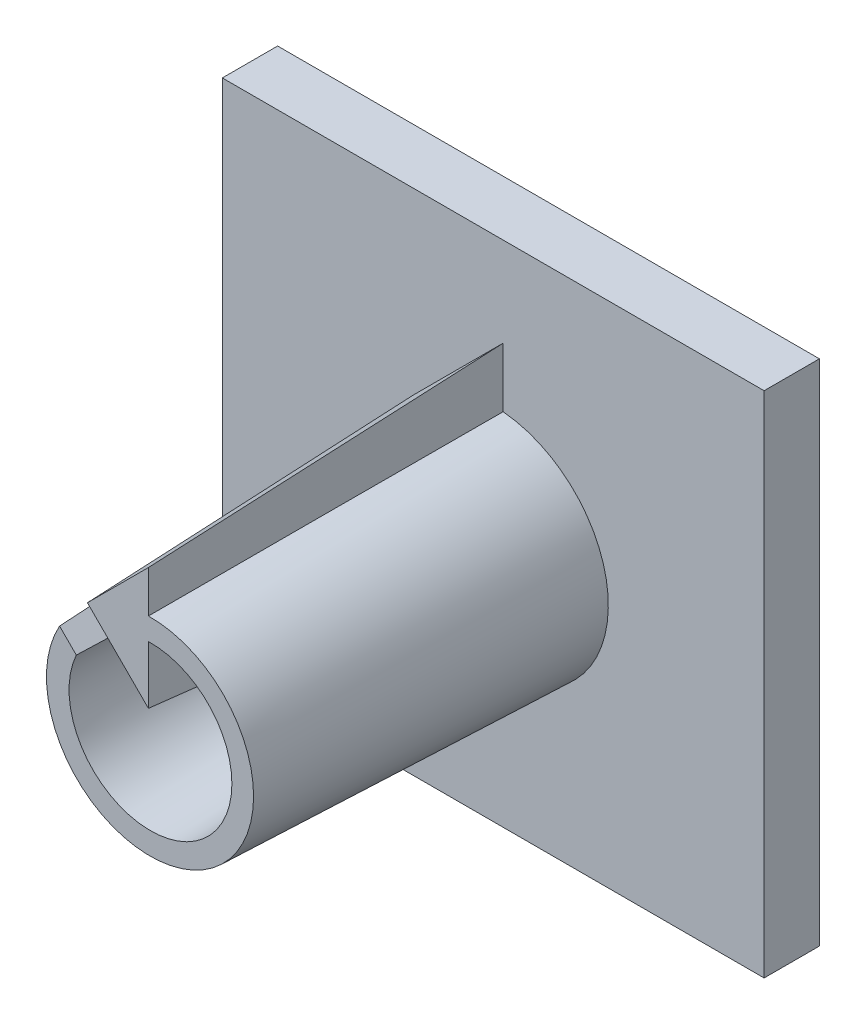
ISO-10303-21;
HEADER;
FILE_DESCRIPTION(('STEP AP214'),'2;1');
FILE_NAME('part.step','',(''),(''),'','','');
FILE_SCHEMA(('AUTOMOTIVE_DESIGN { 1 0 10303 214 1 1 1 1 }'));
ENDSEC;
DATA;
#1=APPLICATION_CONTEXT('core data for automotive mechanical design processes');
#2=APPLICATION_PROTOCOL_DEFINITION('international standard','automotive_design',2000,#1);
#3=PRODUCT_CONTEXT('',#1,'mechanical');
#4=PRODUCT('Part','Part','',(#3));
#5=PRODUCT_RELATED_PRODUCT_CATEGORY('part','',(#4));
#6=PRODUCT_DEFINITION_FORMATION('','',#4);
#7=PRODUCT_DEFINITION_CONTEXT('part definition',#1,'design');
#8=PRODUCT_DEFINITION('design','',#6,#7);
#9=PRODUCT_DEFINITION_SHAPE('','',#8);
#10=(LENGTH_UNIT() NAMED_UNIT(*) SI_UNIT(.MILLI.,.METRE.));
#11=(NAMED_UNIT(*) PLANE_ANGLE_UNIT() SI_UNIT($,.RADIAN.));
#12=(NAMED_UNIT(*) SI_UNIT($,.STERADIAN.) SOLID_ANGLE_UNIT());
#13=UNCERTAINTY_MEASURE_WITH_UNIT(LENGTH_MEASURE(1.E-05),#10,'distance_accuracy_value','');
#14=(GEOMETRIC_REPRESENTATION_CONTEXT(3) GLOBAL_UNCERTAINTY_ASSIGNED_CONTEXT((#13)) GLOBAL_UNIT_ASSIGNED_CONTEXT((#10,
#11,#12)) REPRESENTATION_CONTEXT('',''));
#15=CARTESIAN_POINT('',(0.,0.,0.));
#16=DIRECTION('',(0.,0.,1.));
#17=DIRECTION('',(1.,0.,0.));
#18=AXIS2_PLACEMENT_3D('',#15,#16,#17);
#19=CARTESIAN_POINT('',(-0.0464401295862487,0.,7.74825502516488));
#20=DIRECTION('',(0.999390827019096,0.,0.0348994967025009));
#21=DIRECTION('',(0.0348994967025009,0.,-0.999390827019096));
#22=AXIS2_PLACEMENT_3D('',#19,#20,#21);
#23=PLANE('',#22);
#24=DIRECTION('',(0.,1.,0.));
#25=VECTOR('',#24,1.);
#26=CARTESIAN_POINT('',(0.224134898110809,0.,0.));
#27=LINE('',#26,#25);
#28=CARTESIAN_POINT('',(0.224134898110809,-0.334170235390058,0.));
#29=VERTEX_POINT('',#28);
#30=CARTESIAN_POINT('',(0.224134898110811,1.34165874751207,0.));
#31=VERTEX_POINT('',#30);
#32=EDGE_CURVE('E98',#29,#31,#27,.T.);
#33=ORIENTED_EDGE('',*,*,#32,.T.);
#34=CARTESIAN_POINT('',(0.224134898110811,1.34165874751407,0.));
#35=CARTESIAN_POINT('',(0.100223067905449,1.48472228202619,3.5483705545104));
#36=CARTESIAN_POINT('',(-0.046501065450233,1.62778581653836,7.75));
#37=B_SPLINE_CURVE_WITH_KNOTS('',2,(#34,#35,#36),.UNSPECIFIED.,.F.,.F.,(3,3),(0.,1.),.UNSPECIFIED.);
#38=CARTESIAN_POINT('',(-0.0465010654502338,1.62778581653643,7.74999999999363));
#39=VERTEX_POINT('',#38);
#40=EDGE_CURVE('E100',#31,#39,#37,.T.);
#41=ORIENTED_EDGE('',*,*,#40,.T.);
#42=DIRECTION('',(0.,1.,0.));
#43=VECTOR('',#42,1.);
#44=CARTESIAN_POINT('',(-0.0465010654502346,0.,7.75));
#45=LINE('',#44,#43);
#46=CARTESIAN_POINT('',(-0.0465010654502346,0.319105544891401,7.75));
#47=VERTEX_POINT('',#46);
#48=EDGE_CURVE('E236',#47,#39,#45,.T.);
#49=ORIENTED_EDGE('',*,*,#48,.F.);
#50=DIRECTION('',(-0.0347763151945401,0.0839449574442928,0.995863370157355));
#51=VECTOR('',#50,1.);
#52=CARTESIAN_POINT('',(0.22413489811081,-0.334170235390058,0.));
#53=LINE('',#52,#51);
#54=EDGE_CURVE('E103',#29,#47,#53,.T.);
#55=ORIENTED_EDGE('',*,*,#54,.F.);
#56=EDGE_LOOP('',(#33,#41,#49,#55));
#57=FACE_BOUND('',#56,.T.);
#58=ADVANCED_FACE('F17',(#57),#23,.T.);
#59=CARTESIAN_POINT('',(-0.564015304755316,-0.564277731320889,7.74825502516488));
#60=DIRECTION('',(0.706511647901726,0.706840375551015,0.0348994967025009));
#61=DIRECTION('',(-0.707271226072109,0.706942298048756,0.));
#62=AXIS2_PLACEMENT_3D('',#59,#60,#61);
#63=PLANE('',#62);
#64=DIRECTION('',(-0.707271226072109,0.706942298048756,0.));
#65=VECTOR('',#64,1.);
#66=CARTESIAN_POINT('',(-0.372734372880552,-0.372907799737096,0.));
#67=LINE('',#66,#65);
#68=CARTESIAN_POINT('',(-1.34460105643634,0.598506901360758,0.));
#69=VERTEX_POINT('',#68);
#70=CARTESIAN_POINT('',(-2.1000285044062,1.35358302547057,0.));
#71=VERTEX_POINT('',#70);
#72=EDGE_CURVE('E108',#69,#71,#67,.T.);
#73=ORIENTED_EDGE('',*,*,#72,.T.);
#74=CARTESIAN_POINT('',(-2.05550617321572,0.926433338687819,7.74999999999488));
#75=CARTESIAN_POINT('',(-2.06152289410602,0.969623637817613,6.99704461814808));
#76=CARTESIAN_POINT('',(-2.06697951080161,1.0122558787468,6.24405307332957));
#77=CARTESIAN_POINT('',(-2.07689228728451,1.09652335802127,4.73800944476584));
#78=CARTESIAN_POINT('',(-2.08134844956721,1.13815859885307,3.9849573611763));
#79=CARTESIAN_POINT('',(-2.08823649347963,1.20881972304294,2.69325815163994));
#80=CARTESIAN_POINT('',(-2.09088345941313,1.23805995751134,2.1546238495619));
#81=CARTESIAN_POINT('',(-2.09576037471537,1.29612485089476,1.07732998773076));
#82=CARTESIAN_POINT('',(-2.09799032334138,1.32494950906952,0.538670427934388));
#83=CARTESIAN_POINT('',(-2.1000285044062,1.35358302547057,0.));
#84=B_SPLINE_CURVE_WITH_KNOTS('',3,(#74,#75,#76,#77,#78,#79,#80,#81,#82,#83),.UNSPECIFIED.,.F.,
.F.,(4,2,2,2,4),(0.,2.26265038716259,4.52529513065797,6.14359647263488,7.76190069690386),.UNSPECIFIED.);
#85=CARTESIAN_POINT('',(-2.05550617321584,0.926433338687688,7.74999999999363));
#86=VERTEX_POINT('',#85);
#87=EDGE_CURVE('E141',#86,#71,#84,.T.);
#88=ORIENTED_EDGE('',*,*,#87,.F.);
#89=DIRECTION('',(-0.70727122607211,0.706942298048755,0.));
#90=VECTOR('',#89,1.);
#91=CARTESIAN_POINT('',(-1.67659450060267,0.547697885130098,7.75));
#92=LINE('',#91,#90);
#93=CARTESIAN_POINT('',(-1.67659450060121,0.547697885128642,7.74999999999363));
#94=VERTEX_POINT('',#93);
#95=EDGE_CURVE('E232',#94,#86,#92,.T.);
#96=ORIENTED_EDGE('',*,*,#95,.F.);
#97=CARTESIAN_POINT('',(-1.67659450060267,0.547697885130098,7.75));
#98=CARTESIAN_POINT('',(-1.50473920707531,0.578963690583001,3.6376856728824));
#99=CARTESIAN_POINT('',(-1.34460105643778,0.5985069013622,0.));
#100=B_SPLINE_CURVE_WITH_KNOTS('',2,(#97,#98,#99),.UNSPECIFIED.,.F.,.F.,(3,3),(0.,1.),.UNSPECIFIED.);
#101=EDGE_CURVE('E240',#94,#69,#100,.T.);
#102=ORIENTED_EDGE('',*,*,#101,.T.);
#103=EDGE_LOOP('',(#73,#88,#96,#102));
#104=FACE_BOUND('',#103,.T.);
#105=ADVANCED_FACE('F244',(#104),#63,.T.);
#106=CARTESIAN_POINT('',(0.,0.,7.75));
#107=DIRECTION('',(0.,0.,1.));
#108=DIRECTION('',(1.,0.,0.));
#109=AXIS2_PLACEMENT_3D('',#106,#107,#108);
#110=PLANE('',#109);
#111=ORIENTED_EDGE('',*,*,#95,.T.);
#112=CARTESIAN_POINT('',(-0.0102924476809863,-0.213841015526035,7.74999999998727));
#113=DIRECTION('',(0.,0.,-1.));
#114=DIRECTION('',(-1.,0.,0.));
#115=AXIS2_PLACEMENT_3D('',#112,#113,#114);
#116=CIRCLE('',#115,2.34160730823824);
#117=CARTESIAN_POINT('',(-0.0466884301863027,2.12748342129411,7.74999999999363));
#118=VERTEX_POINT('',#117);
#119=EDGE_CURVE('E243',#118,#86,#116,.T.);
#120=ORIENTED_EDGE('',*,*,#119,.F.);
#121=DIRECTION('',(0.,1.,0.));
#122=VECTOR('',#121,1.);
#123=CARTESIAN_POINT('',(-0.0466884301865255,0.,7.75));
#124=LINE('',#123,#122);
#125=CARTESIAN_POINT('',(-0.0466884301865246,3.07697364852253,7.75));
#126=VERTEX_POINT('',#125);
#127=EDGE_CURVE('E227',#126,#118,#124,.F.);
#128=ORIENTED_EDGE('',*,*,#127,.F.);
#129=DIRECTION('',(-0.707106781186548,-0.707106781186547,0.));
#130=VECTOR('',#129,1.);
#131=CARTESIAN_POINT('',(-1.56183103935453,1.56183103935453,7.75));
#132=LINE('',#131,#130);
#133=CARTESIAN_POINT('',(-1.42567393308188,1.69798814562718,7.75));
#134=VERTEX_POINT('',#133);
#135=EDGE_CURVE('E140',#134,#126,#132,.F.);
#136=ORIENTED_EDGE('',*,*,#135,.F.);
#137=DIRECTION('',(0.707181195530659,-0.707032359010412,0.));
#138=VECTOR('',#137,1.);
#139=CARTESIAN_POINT('',(0.136307130112268,0.136335823960111,7.75));
#140=LINE('',#139,#138);
#141=EDGE_CURVE('E226',#47,#134,#140,.F.);
#142=ORIENTED_EDGE('',*,*,#141,.F.);
#143=ORIENTED_EDGE('',*,*,#48,.T.);
#144=CARTESIAN_POINT('',(0.,-0.212525788811035,7.74999999998727));
#145=DIRECTION('',(0.,0.,1.));
#146=DIRECTION('',(1.,0.,0.));
#147=AXIS2_PLACEMENT_3D('',#144,#145,#146);
#148=CIRCLE('',#147,1.84089900696846);
#149=EDGE_CURVE('E21',#39,#94,#148,.F.);
#150=ORIENTED_EDGE('',*,*,#149,.T.);
#151=EDGE_LOOP('',(#111,#120,#128,#136,#142,#143,#150));
#152=FACE_BOUND('',#151,.T.);
#153=ADVANCED_FACE('F167',(#152),#110,.T.);
#154=CARTESIAN_POINT('',(-0.0466274943225394,0.,7.74825502516488));
#155=DIRECTION('',(0.999390827019096,0.,0.0348994967025009));
#156=DIRECTION('',(0.0348994967025009,0.,-0.999390827019096));
#157=AXIS2_PLACEMENT_3D('',#154,#155,#156);
#158=PLANE('',#157);
#159=CARTESIAN_POINT('',(0.223947533374519,2.3878789045166,0.));
#160=CARTESIAN_POINT('',(0.194598555714436,2.36105089632738,0.840444757868776));
#161=CARTESIAN_POINT('',(0.165250028596691,2.33381359027133,1.68087661389303));
#162=CARTESIAN_POINT('',(0.106554055487715,2.2784256503355,3.36170936652889));
#163=CARTESIAN_POINT('',(0.0772066094953814,2.25027501741356,4.20211026317204));
#164=CARTESIAN_POINT('',(0.0321013705520176,2.20623360090774,5.49375530994064));
#165=CARTESIAN_POINT('',(0.0163431507418342,2.19070153647731,5.94501168371291));
#166=CARTESIAN_POINT('',(-0.0151729232808475,2.15932860649357,6.84751396190954));
#167=CARTESIAN_POINT('',(-0.0309307774931349,2.1434877407665,7.29875986632786));
#168=CARTESIAN_POINT('',(-0.0466884301863464,2.12748342129406,7.74999999999488));
#169=B_SPLINE_CURVE_WITH_KNOTS('',3,(#159,#160,#161,#162,#163,#164,#165,#166,#167,#168),
.UNSPECIFIED.,.F.,.F.,(4,2,2,2,4),(0.,2.52415474145411,5.04830683582052,6.40370222744302,
7.75909838178685),.UNSPECIFIED.);
#170=CARTESIAN_POINT('',(0.22394753337452,2.3878789045166,0.));
#171=VERTEX_POINT('',#170);
#172=EDGE_CURVE('E131',#171,#118,#169,.T.);
#173=ORIENTED_EDGE('',*,*,#172,.F.);
#174=DIRECTION('',(0.,1.,0.));
#175=VECTOR('',#174,1.);
#176=CARTESIAN_POINT('',(0.22394753337452,0.,0.));
#177=LINE('',#176,#175);
#178=CARTESIAN_POINT('',(0.223947533374521,3.73034666221752,0.));
#179=VERTEX_POINT('',#178);
#180=EDGE_CURVE('E224',#171,#179,#177,.T.);
#181=ORIENTED_EDGE('',*,*,#180,.T.);
#182=DIRECTION('',(0.0347762787171803,0.0839573637278827,-0.995862325582432));
#183=VECTOR('',#182,1.);
#184=CARTESIAN_POINT('',(-0.0466884301865244,3.07697364852253,7.75));
#185=LINE('',#184,#183);
#186=EDGE_CURVE('E223',#126,#179,#185,.T.);
#187=ORIENTED_EDGE('',*,*,#186,.F.);
#188=ORIENTED_EDGE('',*,*,#127,.T.);
#189=EDGE_LOOP('',(#173,#181,#187,#188));
#190=FACE_BOUND('',#189,.T.);
#191=ADVANCED_FACE('F146',(#190),#158,.T.);
#192=CARTESIAN_POINT('',(0.136264046484606,0.136292731262967,7.74825502516488));
#193=DIRECTION('',(-0.706601654000678,-0.706750399853738,0.0348994967025009));
#194=DIRECTION('',(0.707181195530659,-0.707032359010412,0.));
#195=AXIS2_PLACEMENT_3D('',#192,#193,#194);
#196=PLANE('',#195);
#197=DIRECTION('',(0.70718119553066,-0.707032359010411,0.));
#198=VECTOR('',#197,1.);
#199=CARTESIAN_POINT('',(-1.80843112453328,1.69796800430972,0.));
#200=LINE('',#199,#198);
#201=CARTESIAN_POINT('',(-1.80843112453328,1.69796800430972,0.));
#202=VERTEX_POINT('',#201);
#203=EDGE_CURVE('E122',#202,#29,#200,.T.);
#204=ORIENTED_EDGE('',*,*,#203,.T.);
#205=ORIENTED_EDGE('',*,*,#54,.T.);
#206=ORIENTED_EDGE('',*,*,#141,.T.);
#207=DIRECTION('',(0.0493279016025,2.59571589506546E-06,0.998782638073348));
#208=VECTOR('',#207,1.);
#209=CARTESIAN_POINT('',(-1.80843112453328,1.69796800430972,0.));
#210=LINE('',#209,#208);
#211=EDGE_CURVE('E127',#202,#134,#210,.T.);
#212=ORIENTED_EDGE('',*,*,#211,.F.);
#213=EDGE_LOOP('',(#204,#205,#206,#212));
#214=FACE_BOUND('',#213,.T.);
#215=ADVANCED_FACE('F160',(#214),#196,.T.);
#216=CARTESIAN_POINT('',(0.,-0.212525788811035,7.74999999987358));
#217=DIRECTION('',(0.,0.,1.));
#218=DIRECTION('',(1.,0.,0.));
#219=AXIS2_PLACEMENT_3D('',#216,#217,#218);
#220=CONICAL_SURFACE('',#219,1.84089900696449,0.0349065850399577);
#221=ORIENTED_EDGE('',*,*,#149,.F.);
#222=ORIENTED_EDGE('',*,*,#40,.F.);
#223=CARTESIAN_POINT('',(0.,-0.212525788811035,0.));
#224=DIRECTION('',(0.,0.,1.));
#225=DIRECTION('',(1.,0.,0.));
#226=AXIS2_PLACEMENT_3D('',#223,#224,#225);
#227=CIRCLE('',#226,1.57026304340731);
#228=EDGE_CURVE('E115',#31,#69,#227,.F.);
#229=ORIENTED_EDGE('',*,*,#228,.T.);
#230=ORIENTED_EDGE('',*,*,#101,.F.);
#231=EDGE_LOOP('',(#221,#222,#229,#230));
#232=FACE_BOUND('',#231,.T.);
#233=ADVANCED_FACE('F113',(#232),#220,.F.);
#234=CARTESIAN_POINT('',(-0.0102924476809863,-0.213841015526035,5.6843418860808E-11));
#235=DIRECTION('',(0.,0.,-1.));
#236=DIRECTION('',(-1.,0.,0.));
#237=AXIS2_PLACEMENT_3D('',#234,#235,#236);
#238=CONICAL_SURFACE('',#237,2.61224327179939,0.0349065850402135);
#239=CARTESIAN_POINT('',(-0.0102924476809863,-0.213841015526035,0.));
#240=DIRECTION('',(0.,0.,-1.));
#241=DIRECTION('',(-1.,0.,0.));
#242=AXIS2_PLACEMENT_3D('',#239,#240,#241);
#243=CIRCLE('',#242,2.61224327180138);
#244=EDGE_CURVE('E121',#71,#171,#243,.F.);
#245=ORIENTED_EDGE('',*,*,#244,.T.);
#246=ORIENTED_EDGE('',*,*,#172,.T.);
#247=ORIENTED_EDGE('',*,*,#119,.T.);
#248=ORIENTED_EDGE('',*,*,#87,.T.);
#249=EDGE_LOOP('',(#245,#246,#247,#248));
#250=FACE_BOUND('',#249,.T.);
#251=ADVANCED_FACE('F150',(#250),#238,.T.);
#252=CARTESIAN_POINT('',(-1.56187412751717,1.56187412751717,7.74825502516488));
#253=DIRECTION('',(-0.706676030840834,0.706676030840835,0.0348994967025009));
#254=DIRECTION('',(-0.707106781186548,-0.707106781186547,0.));
#255=AXIS2_PLACEMENT_3D('',#252,#253,#254);
#256=PLANE('',#255);
#257=DIRECTION('',(-0.707106781186548,-0.707106781186548,0.));
#258=VECTOR('',#257,1.);
#259=CARTESIAN_POINT('',(0.22394753337452,3.73034666221752,0.));
#260=LINE('',#259,#258);
#261=EDGE_CURVE('E125',#179,#202,#260,.T.);
#262=ORIENTED_EDGE('',*,*,#261,.T.);
#263=ORIENTED_EDGE('',*,*,#211,.T.);
#264=ORIENTED_EDGE('',*,*,#135,.T.);
#265=ORIENTED_EDGE('',*,*,#186,.T.);
#266=EDGE_LOOP('',(#262,#263,#264,#265));
#267=FACE_BOUND('',#266,.T.);
#268=ADVANCED_FACE('F155',(#267),#256,.T.);
#269=CARTESIAN_POINT('',(0.,0.,0.));
#270=DIRECTION('',(0.,0.,-1.));
#271=DIRECTION('',(-1.,0.,0.));
#272=AXIS2_PLACEMENT_3D('',#269,#270,#271);
#273=PLANE('',#272);
#274=DIRECTION('',(0.,1.,0.));
#275=VECTOR('',#274,1.);
#276=CARTESIAN_POINT('',(-6.125,0.,0.));
#277=LINE('',#276,#275);
#278=CARTESIAN_POINT('',(-6.125,5.75,0.));
#279=VERTEX_POINT('',#278);
#280=CARTESIAN_POINT('',(-6.125,-5.75,0.));
#281=VERTEX_POINT('',#280);
#282=EDGE_CURVE('E200',#279,#281,#277,.F.);
#283=ORIENTED_EDGE('',*,*,#282,.T.);
#284=DIRECTION('',(1.,0.,0.));
#285=VECTOR('',#284,1.);
#286=CARTESIAN_POINT('',(0.,-5.75,0.));
#287=LINE('',#286,#285);
#288=CARTESIAN_POINT('',(6.125,-5.75,0.));
#289=VERTEX_POINT('',#288);
#290=EDGE_CURVE('E202',#281,#289,#287,.T.);
#291=ORIENTED_EDGE('',*,*,#290,.T.);
#292=DIRECTION('',(0.,-1.,0.));
#293=VECTOR('',#292,1.);
#294=CARTESIAN_POINT('',(6.125,0.,0.));
#295=LINE('',#294,#293);
#296=CARTESIAN_POINT('',(6.125,5.75,0.));
#297=VERTEX_POINT('',#296);
#298=EDGE_CURVE('E216',#289,#297,#295,.F.);
#299=ORIENTED_EDGE('',*,*,#298,.T.);
#300=DIRECTION('',(1.,0.,0.));
#301=VECTOR('',#300,1.);
#302=CARTESIAN_POINT('',(0.,5.75,0.));
#303=LINE('',#302,#301);
#304=EDGE_CURVE('E204',#297,#279,#303,.F.);
#305=ORIENTED_EDGE('',*,*,#304,.T.);
#306=EDGE_LOOP('',(#283,#291,#299,#305));
#307=FACE_BOUND('',#306,.T.);
#308=ORIENTED_EDGE('',*,*,#180,.F.);
#309=ORIENTED_EDGE('',*,*,#244,.F.);
#310=ORIENTED_EDGE('',*,*,#72,.F.);
#311=ORIENTED_EDGE('',*,*,#228,.F.);
#312=ORIENTED_EDGE('',*,*,#32,.F.);
#313=ORIENTED_EDGE('',*,*,#203,.F.);
#314=ORIENTED_EDGE('',*,*,#261,.F.);
#315=EDGE_LOOP('',(#308,#309,#310,#311,#312,#313,#314));
#316=FACE_BOUND('',#315,.T.);
#317=ADVANCED_FACE('F118',(#307,#316),#273,.F.);
#318=CARTESIAN_POINT('',(0.,5.75,-1.25));
#319=DIRECTION('',(0.,-1.,0.));
#320=DIRECTION('',(0.,0.,-1.));
#321=AXIS2_PLACEMENT_3D('',#318,#319,#320);
#322=PLANE('',#321);
#323=DIRECTION('',(0.,0.,1.));
#324=VECTOR('',#323,1.);
#325=CARTESIAN_POINT('',(6.125,5.75,-1.25));
#326=LINE('',#325,#324);
#327=CARTESIAN_POINT('',(6.125,5.75,-1.25));
#328=VERTEX_POINT('',#327);
#329=EDGE_CURVE('E218',#297,#328,#326,.F.);
#330=ORIENTED_EDGE('',*,*,#329,.T.);
#331=DIRECTION('',(-1.,0.,0.));
#332=VECTOR('',#331,1.);
#333=CARTESIAN_POINT('',(0.,5.75,-1.25));
#334=LINE('',#333,#332);
#335=CARTESIAN_POINT('',(-6.125,5.75,-1.25));
#336=VERTEX_POINT('',#335);
#337=EDGE_CURVE('E207',#336,#328,#334,.F.);
#338=ORIENTED_EDGE('',*,*,#337,.F.);
#339=DIRECTION('',(0.,0.,1.));
#340=VECTOR('',#339,1.);
#341=CARTESIAN_POINT('',(-6.125,5.75,-1.25));
#342=LINE('',#341,#340);
#343=EDGE_CURVE('E208',#336,#279,#342,.T.);
#344=ORIENTED_EDGE('',*,*,#343,.T.);
#345=ORIENTED_EDGE('',*,*,#304,.F.);
#346=EDGE_LOOP('',(#330,#338,#344,#345));
#347=FACE_BOUND('',#346,.T.);
#348=ADVANCED_FACE('F187',(#347),#322,.F.);
#349=CARTESIAN_POINT('',(6.125,0.,-1.25));
#350=DIRECTION('',(-1.,0.,0.));
#351=DIRECTION('',(0.,-1.,0.));
#352=AXIS2_PLACEMENT_3D('',#349,#350,#351);
#353=PLANE('',#352);
#354=DIRECTION('',(0.,0.,1.));
#355=VECTOR('',#354,1.);
#356=CARTESIAN_POINT('',(6.125,-5.75,-1.25));
#357=LINE('',#356,#355);
#358=CARTESIAN_POINT('',(6.125,-5.75,-1.25));
#359=VERTEX_POINT('',#358);
#360=EDGE_CURVE('E212',#289,#359,#357,.F.);
#361=ORIENTED_EDGE('',*,*,#360,.T.);
#362=DIRECTION('',(0.,1.,0.));
#363=VECTOR('',#362,1.);
#364=CARTESIAN_POINT('',(6.125,0.,-1.25));
#365=LINE('',#364,#363);
#366=EDGE_CURVE('E381',#328,#359,#365,.F.);
#367=ORIENTED_EDGE('',*,*,#366,.F.);
#368=ORIENTED_EDGE('',*,*,#329,.F.);
#369=ORIENTED_EDGE('',*,*,#298,.F.);
#370=EDGE_LOOP('',(#361,#367,#368,#369));
#371=FACE_BOUND('',#370,.T.);
#372=ADVANCED_FACE('F184',(#371),#353,.F.);
#373=CARTESIAN_POINT('',(0.,-5.75,-1.25));
#374=DIRECTION('',(0.,1.,0.));
#375=DIRECTION('',(0.,0.,1.));
#376=AXIS2_PLACEMENT_3D('',#373,#374,#375);
#377=PLANE('',#376);
#378=DIRECTION('',(0.,0.,1.));
#379=VECTOR('',#378,1.);
#380=CARTESIAN_POINT('',(-6.125,-5.75,-1.25));
#381=LINE('',#380,#379);
#382=CARTESIAN_POINT('',(-6.125,-5.75,-1.25));
#383=VERTEX_POINT('',#382);
#384=EDGE_CURVE('E36',#281,#383,#381,.F.);
#385=ORIENTED_EDGE('',*,*,#384,.T.);
#386=DIRECTION('',(-1.,0.,0.));
#387=VECTOR('',#386,1.);
#388=CARTESIAN_POINT('',(0.,-5.75,-1.25));
#389=LINE('',#388,#387);
#390=EDGE_CURVE('E27',#359,#383,#389,.T.);
#391=ORIENTED_EDGE('',*,*,#390,.F.);
#392=ORIENTED_EDGE('',*,*,#360,.F.);
#393=ORIENTED_EDGE('',*,*,#290,.F.);
#394=EDGE_LOOP('',(#385,#391,#392,#393));
#395=FACE_BOUND('',#394,.T.);
#396=ADVANCED_FACE('F177',(#395),#377,.F.);
#397=CARTESIAN_POINT('',(-6.125,0.,-1.25));
#398=DIRECTION('',(1.,0.,0.));
#399=DIRECTION('',(0.,1.,0.));
#400=AXIS2_PLACEMENT_3D('',#397,#398,#399);
#401=PLANE('',#400);
#402=ORIENTED_EDGE('',*,*,#343,.F.);
#403=DIRECTION('',(0.,1.,0.));
#404=VECTOR('',#403,1.);
#405=CARTESIAN_POINT('',(-6.125,0.,-1.25));
#406=LINE('',#405,#404);
#407=EDGE_CURVE('E11',#383,#336,#406,.T.);
#408=ORIENTED_EDGE('',*,*,#407,.F.);
#409=ORIENTED_EDGE('',*,*,#384,.F.);
#410=ORIENTED_EDGE('',*,*,#282,.F.);
#411=EDGE_LOOP('',(#402,#408,#409,#410));
#412=FACE_BOUND('',#411,.T.);
#413=ADVANCED_FACE('F171',(#412),#401,.F.);
#414=CARTESIAN_POINT('',(0.,0.,-1.25));
#415=DIRECTION('',(0.,0.,-1.));
#416=DIRECTION('',(-1.,0.,0.));
#417=AXIS2_PLACEMENT_3D('',#414,#415,#416);
#418=PLANE('',#417);
#419=ORIENTED_EDGE('',*,*,#390,.T.);
#420=ORIENTED_EDGE('',*,*,#407,.T.);
#421=ORIENTED_EDGE('',*,*,#337,.T.);
#422=ORIENTED_EDGE('',*,*,#366,.T.);
#423=EDGE_LOOP('',(#419,#420,#421,#422));
#424=FACE_BOUND('',#423,.T.);
#425=ADVANCED_FACE('F169',(#424),#418,.T.);
#426=CLOSED_SHELL('',(#58,#105,#153,#191,#215,#233,#251,#268,#317,#348,#372,#396,#413,#425));
#427=MANIFOLD_SOLID_BREP('B1',#426);
#428=ADVANCED_BREP_SHAPE_REPRESENTATION('',(#18,#427),#14);
#429=SHAPE_DEFINITION_REPRESENTATION(#9,#428);
ENDSEC;
END-ISO-10303-21;
